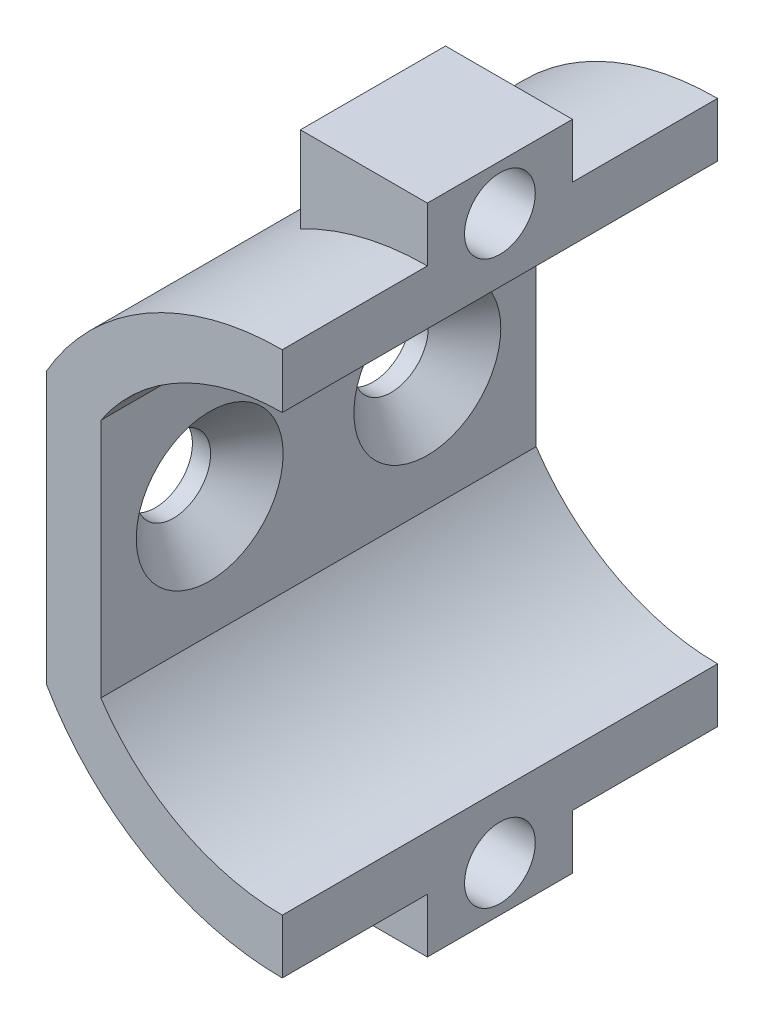
ISO-10303-21;
HEADER;
FILE_DESCRIPTION(('STEP AP214'),'2;1');
FILE_NAME('part.step','',(''),(''),'','','');
FILE_SCHEMA(('AUTOMOTIVE_DESIGN { 1 0 10303 214 1 1 1 1 }'));
ENDSEC;
DATA;
#1=APPLICATION_CONTEXT('core data for automotive mechanical design processes');
#2=APPLICATION_PROTOCOL_DEFINITION('international standard','automotive_design',2000,#1);
#3=PRODUCT_CONTEXT('',#1,'mechanical');
#4=PRODUCT('Part','Part','',(#3));
#5=PRODUCT_RELATED_PRODUCT_CATEGORY('part','',(#4));
#6=PRODUCT_DEFINITION_FORMATION('','',#4);
#7=PRODUCT_DEFINITION_CONTEXT('part definition',#1,'design');
#8=PRODUCT_DEFINITION('design','',#6,#7);
#9=PRODUCT_DEFINITION_SHAPE('','',#8);
#10=(LENGTH_UNIT() NAMED_UNIT(*) SI_UNIT(.MILLI.,.METRE.));
#11=(NAMED_UNIT(*) PLANE_ANGLE_UNIT() SI_UNIT($,.RADIAN.));
#12=(NAMED_UNIT(*) SI_UNIT($,.STERADIAN.) SOLID_ANGLE_UNIT());
#13=UNCERTAINTY_MEASURE_WITH_UNIT(LENGTH_MEASURE(1.E-05),#10,'distance_accuracy_value','');
#14=(GEOMETRIC_REPRESENTATION_CONTEXT(3) GLOBAL_UNCERTAINTY_ASSIGNED_CONTEXT((#13)) GLOBAL_UNIT_ASSIGNED_CONTEXT((#10,
#11,#12)) REPRESENTATION_CONTEXT('',''));
#15=CARTESIAN_POINT('',(0.,0.,0.));
#16=DIRECTION('',(0.,0.,1.));
#17=DIRECTION('',(1.,0.,0.));
#18=AXIS2_PLACEMENT_3D('',#15,#16,#17);
#19=CARTESIAN_POINT('',(0.,0.,0.));
#20=DIRECTION('',(0.,0.,1.));
#21=DIRECTION('',(1.,0.,0.));
#22=AXIS2_PLACEMENT_3D('',#19,#20,#21);
#23=PLANE('',#22);
#24=DIRECTION('',(0.,-1.,0.));
#25=VECTOR('',#24,1.);
#26=CARTESIAN_POINT('',(0.,0.,0.));
#27=LINE('',#26,#25);
#28=CARTESIAN_POINT('',(0.,-6.00000000000003,0.));
#29=VERTEX_POINT('',#28);
#30=CARTESIAN_POINT('',(0.,-7.5,0.));
#31=VERTEX_POINT('',#30);
#32=EDGE_CURVE('E265',#29,#31,#27,.T.);
#33=ORIENTED_EDGE('',*,*,#32,.T.);
#34=CARTESIAN_POINT('',(0.,0.,0.));
#35=DIRECTION('',(0.,0.,1.));
#36=DIRECTION('',(1.,0.,0.));
#37=AXIS2_PLACEMENT_3D('',#34,#35,#36);
#38=CIRCLE('',#37,7.5);
#39=CARTESIAN_POINT('',(-6.50107738392439,-3.73978513396518,0.));
#40=VERTEX_POINT('',#39);
#41=EDGE_CURVE('E269',#40,#31,#38,.T.);
#42=ORIENTED_EDGE('',*,*,#41,.F.);
#43=DIRECTION('',(0.,-1.,0.));
#44=VECTOR('',#43,1.);
#45=CARTESIAN_POINT('',(-6.50107738392439,0.,0.));
#46=LINE('',#45,#44);
#47=CARTESIAN_POINT('',(-6.50107738392439,3.73978513396516,0.));
#48=VERTEX_POINT('',#47);
#49=EDGE_CURVE('E268',#48,#40,#46,.T.);
#50=ORIENTED_EDGE('',*,*,#49,.F.);
#51=CARTESIAN_POINT('',(0.,7.5,0.));
#52=VERTEX_POINT('',#51);
#53=EDGE_CURVE('E264',#52,#48,#38,.T.);
#54=ORIENTED_EDGE('',*,*,#53,.F.);
#55=CARTESIAN_POINT('',(0.,5.99999999999999,0.));
#56=VERTEX_POINT('',#55);
#57=EDGE_CURVE('E235',#52,#56,#27,.T.);
#58=ORIENTED_EDGE('',*,*,#57,.T.);
#59=CARTESIAN_POINT('',(0.,0.,0.));
#60=DIRECTION('',(0.,0.,1.));
#61=DIRECTION('',(1.,0.,0.));
#62=AXIS2_PLACEMENT_3D('',#59,#60,#61);
#63=CIRCLE('',#62,6.);
#64=CARTESIAN_POINT('',(-5.00107738392439,3.31499999999997,0.));
#65=VERTEX_POINT('',#64);
#66=EDGE_CURVE('E245',#56,#65,#63,.T.);
#67=ORIENTED_EDGE('',*,*,#66,.T.);
#68=DIRECTION('',(0.,-1.,0.));
#69=VECTOR('',#68,1.);
#70=CARTESIAN_POINT('',(-5.00107738392439,0.,0.));
#71=LINE('',#70,#69);
#72=CARTESIAN_POINT('',(-5.00107738392439,-3.31500000000002,0.));
#73=VERTEX_POINT('',#72);
#74=EDGE_CURVE('E276',#65,#73,#71,.T.);
#75=ORIENTED_EDGE('',*,*,#74,.T.);
#76=EDGE_CURVE('E272',#73,#29,#63,.T.);
#77=ORIENTED_EDGE('',*,*,#76,.T.);
#78=EDGE_LOOP('',(#33,#42,#50,#54,#58,#67,#75,#77));
#79=FACE_BOUND('',#78,.T.);
#80=ADVANCED_FACE('F46',(#79),#23,.F.);
#81=CARTESIAN_POINT('',(0.,0.,12.));
#82=DIRECTION('',(1.,0.,0.));
#83=DIRECTION('',(0.,0.,-1.));
#84=AXIS2_PLACEMENT_3D('',#81,#82,#83);
#85=PLANE('',#84);
#86=CARTESIAN_POINT('',(0.,-7.75,6.));
#87=DIRECTION('',(-1.,0.,0.));
#88=DIRECTION('',(0.,0.,-1.));
#89=AXIS2_PLACEMENT_3D('',#86,#87,#88);
#90=CIRCLE('',#89,0.975);
#91=CARTESIAN_POINT('',(0.,-7.75,5.025));
#92=VERTEX_POINT('',#91);
#93=EDGE_CURVE('E174',#92,#92,#90,.T.);
#94=ORIENTED_EDGE('',*,*,#93,.T.);
#95=EDGE_LOOP('',(#94));
#96=FACE_BOUND('',#95,.T.);
#97=DIRECTION('',(0.,-1.,0.));
#98=VECTOR('',#97,1.);
#99=CARTESIAN_POINT('',(0.,0.,4.));
#100=LINE('',#99,#98);
#101=CARTESIAN_POINT('',(0.,-7.50000000000002,4.));
#102=VERTEX_POINT('',#101);
#103=CARTESIAN_POINT('',(0.,-9.,4.));
#104=VERTEX_POINT('',#103);
#105=EDGE_CURVE('E307',#102,#104,#100,.T.);
#106=ORIENTED_EDGE('',*,*,#105,.F.);
#107=DIRECTION('',(0.,0.,-1.));
#108=VECTOR('',#107,1.);
#109=CARTESIAN_POINT('',(0.,-7.50000000000002,13.6410752421119));
#110=LINE('',#109,#108);
#111=EDGE_CURVE('E171',#102,#31,#110,.T.);
#112=ORIENTED_EDGE('',*,*,#111,.T.);
#113=ORIENTED_EDGE('',*,*,#32,.F.);
#114=DIRECTION('',(0.,0.,-1.));
#115=VECTOR('',#114,1.);
#116=CARTESIAN_POINT('',(0.,-6.,12.));
#117=LINE('',#116,#115);
#118=CARTESIAN_POINT('',(0.,-6.,12.));
#119=VERTEX_POINT('',#118);
#120=EDGE_CURVE('E290',#119,#29,#117,.T.);
#121=ORIENTED_EDGE('',*,*,#120,.F.);
#122=DIRECTION('',(0.,-1.,0.));
#123=VECTOR('',#122,1.);
#124=CARTESIAN_POINT('',(0.,0.,12.));
#125=LINE('',#124,#123);
#126=CARTESIAN_POINT('',(0.,-7.5,12.));
#127=VERTEX_POINT('',#126);
#128=EDGE_CURVE('E246',#119,#127,#125,.T.);
#129=ORIENTED_EDGE('',*,*,#128,.T.);
#130=DIRECTION('',(0.,0.,1.));
#131=VECTOR('',#130,1.);
#132=CARTESIAN_POINT('',(0.,-7.50000000000002,-1.6410752421119));
#133=LINE('',#132,#131);
#134=CARTESIAN_POINT('',(0.,-7.5,8.));
#135=VERTEX_POINT('',#134);
#136=EDGE_CURVE('E188',#135,#127,#133,.T.);
#137=ORIENTED_EDGE('',*,*,#136,.F.);
#138=DIRECTION('',(0.,-1.,0.));
#139=VECTOR('',#138,1.);
#140=CARTESIAN_POINT('',(0.,0.,8.));
#141=LINE('',#140,#139);
#142=CARTESIAN_POINT('',(0.,-9.,8.));
#143=VERTEX_POINT('',#142);
#144=EDGE_CURVE('E363',#135,#143,#141,.T.);
#145=ORIENTED_EDGE('',*,*,#144,.T.);
#146=DIRECTION('',(0.,0.,1.));
#147=VECTOR('',#146,1.);
#148=CARTESIAN_POINT('',(0.,-9.,-4.22510444216538));
#149=LINE('',#148,#147);
#150=EDGE_CURVE('E182',#104,#143,#149,.T.);
#151=ORIENTED_EDGE('',*,*,#150,.F.);
#152=EDGE_LOOP('',(#106,#112,#113,#121,#129,#137,#145,#151));
#153=FACE_BOUND('',#152,.T.);
#154=ADVANCED_FACE('F373',(#96,#153),#85,.T.);
#155=CARTESIAN_POINT('',(0.,-9.,-4.22510444216538));
#156=DIRECTION('',(0.,1.,0.));
#157=DIRECTION('',(0.,0.,1.));
#158=AXIS2_PLACEMENT_3D('',#155,#156,#157);
#159=PLANE('',#158);
#160=DIRECTION('',(0.,0.,1.));
#161=VECTOR('',#160,1.);
#162=CARTESIAN_POINT('',(-3.5,-9.00000000000003,-4.22510444216538));
#163=LINE('',#162,#161);
#164=CARTESIAN_POINT('',(-3.5,-9.,4.));
#165=VERTEX_POINT('',#164);
#166=CARTESIAN_POINT('',(-3.5,-9.00000000000003,8.));
#167=VERTEX_POINT('',#166);
#168=EDGE_CURVE('E181',#165,#167,#163,.T.);
#169=ORIENTED_EDGE('',*,*,#168,.F.);
#170=DIRECTION('',(1.,0.,0.));
#171=VECTOR('',#170,1.);
#172=CARTESIAN_POINT('',(0.,-9.,4.));
#173=LINE('',#172,#171);
#174=EDGE_CURVE('E163',#165,#104,#173,.T.);
#175=ORIENTED_EDGE('',*,*,#174,.T.);
#176=ORIENTED_EDGE('',*,*,#150,.T.);
#177=DIRECTION('',(1.,0.,0.));
#178=VECTOR('',#177,1.);
#179=CARTESIAN_POINT('',(0.,-9.,8.));
#180=LINE('',#179,#178);
#181=EDGE_CURVE('E359',#167,#143,#180,.T.);
#182=ORIENTED_EDGE('',*,*,#181,.F.);
#183=EDGE_LOOP('',(#169,#175,#176,#182));
#184=FACE_BOUND('',#183,.T.);
#185=ADVANCED_FACE('F409',(#184),#159,.F.);
#186=CARTESIAN_POINT('',(-3.5,0.,-4.22510444216538));
#187=DIRECTION('',(1.,0.,0.));
#188=DIRECTION('',(0.,1.,0.));
#189=AXIS2_PLACEMENT_3D('',#186,#187,#188);
#190=PLANE('',#189);
#191=CARTESIAN_POINT('',(-3.5,-7.75000000000002,6.));
#192=DIRECTION('',(1.,0.,0.));
#193=DIRECTION('',(0.,1.,0.));
#194=AXIS2_PLACEMENT_3D('',#191,#192,#193);
#195=CIRCLE('',#194,0.975);
#196=CARTESIAN_POINT('',(-3.5,-6.77500000000002,6.));
#197=VERTEX_POINT('',#196);
#198=EDGE_CURVE('E346',#197,#197,#195,.T.);
#199=ORIENTED_EDGE('',*,*,#198,.T.);
#200=EDGE_LOOP('',(#199));
#201=FACE_BOUND('',#200,.T.);
#202=DIRECTION('',(0.,0.,1.));
#203=VECTOR('',#202,1.);
#204=CARTESIAN_POINT('',(-3.5,-6.63324958071082,-4.22510444216538));
#205=LINE('',#204,#203);
#206=CARTESIAN_POINT('',(-3.5,-6.63324958071082,4.));
#207=VERTEX_POINT('',#206);
#208=CARTESIAN_POINT('',(-3.5,-6.6332495807108,8.));
#209=VERTEX_POINT('',#208);
#210=EDGE_CURVE('E70',#207,#209,#205,.T.);
#211=ORIENTED_EDGE('',*,*,#210,.F.);
#212=DIRECTION('',(0.,-1.,0.));
#213=VECTOR('',#212,1.);
#214=CARTESIAN_POINT('',(-3.5,0.,4.));
#215=LINE('',#214,#213);
#216=EDGE_CURVE('E160',#207,#165,#215,.T.);
#217=ORIENTED_EDGE('',*,*,#216,.T.);
#218=ORIENTED_EDGE('',*,*,#168,.T.);
#219=DIRECTION('',(0.,-1.,0.));
#220=VECTOR('',#219,1.);
#221=CARTESIAN_POINT('',(-3.5,0.,8.));
#222=LINE('',#221,#220);
#223=EDGE_CURVE('E179',#209,#167,#222,.T.);
#224=ORIENTED_EDGE('',*,*,#223,.F.);
#225=EDGE_LOOP('',(#211,#217,#218,#224));
#226=FACE_BOUND('',#225,.T.);
#227=ADVANCED_FACE('F177',(#201,#226),#190,.F.);
#228=CARTESIAN_POINT('',(0.,0.,12.));
#229=DIRECTION('',(0.,0.,-1.));
#230=DIRECTION('',(-1.,0.,0.));
#231=AXIS2_PLACEMENT_3D('',#228,#229,#230);
#232=CYLINDRICAL_SURFACE('',#231,7.5);
#233=ORIENTED_EDGE('',*,*,#41,.T.);
#234=ORIENTED_EDGE('',*,*,#111,.F.);
#235=CARTESIAN_POINT('',(0.,0.,4.));
#236=DIRECTION('',(0.,0.,1.));
#237=DIRECTION('',(1.,0.,0.));
#238=AXIS2_PLACEMENT_3D('',#235,#236,#237);
#239=CIRCLE('',#238,7.5);
#240=EDGE_CURVE('E63',#102,#207,#239,.F.);
#241=ORIENTED_EDGE('',*,*,#240,.T.);
#242=ORIENTED_EDGE('',*,*,#210,.T.);
#243=CARTESIAN_POINT('',(0.,0.,8.));
#244=DIRECTION('',(0.,0.,1.));
#245=DIRECTION('',(1.,0.,0.));
#246=AXIS2_PLACEMENT_3D('',#243,#244,#245);
#247=CIRCLE('',#246,7.5);
#248=EDGE_CURVE('E167',#209,#135,#247,.T.);
#249=ORIENTED_EDGE('',*,*,#248,.T.);
#250=ORIENTED_EDGE('',*,*,#136,.T.);
#251=CARTESIAN_POINT('',(0.,0.,12.));
#252=DIRECTION('',(0.,0.,1.));
#253=DIRECTION('',(1.,0.,0.));
#254=AXIS2_PLACEMENT_3D('',#251,#252,#253);
#255=CIRCLE('',#254,7.5);
#256=CARTESIAN_POINT('',(-6.50107738392439,-3.73978513396516,12.));
#257=VERTEX_POINT('',#256);
#258=EDGE_CURVE('E250',#257,#127,#255,.T.);
#259=ORIENTED_EDGE('',*,*,#258,.F.);
#260=DIRECTION('',(0.,0.,-1.));
#261=VECTOR('',#260,1.);
#262=CARTESIAN_POINT('',(-6.50107738392439,-3.73978513396516,12.));
#263=LINE('',#262,#261);
#264=EDGE_CURVE('E293',#257,#40,#263,.T.);
#265=ORIENTED_EDGE('',*,*,#264,.T.);
#266=EDGE_LOOP('',(#233,#234,#241,#242,#249,#250,#259,#265));
#267=FACE_BOUND('',#266,.T.);
#268=ADVANCED_FACE('F169',(#267),#232,.T.);
#269=CARTESIAN_POINT('',(0.,7.74999999999999,6.00000000000001));
#270=DIRECTION('',(1.,0.,0.));
#271=DIRECTION('',(0.,0.,-1.));
#272=AXIS2_PLACEMENT_3D('',#269,#270,#271);
#273=CIRCLE('',#272,0.975);
#274=CARTESIAN_POINT('',(0.,7.74999999999999,5.025));
#275=VERTEX_POINT('',#274);
#276=EDGE_CURVE('E192',#275,#275,#273,.T.);
#277=ORIENTED_EDGE('',*,*,#276,.F.);
#278=EDGE_LOOP('',(#277));
#279=FACE_BOUND('',#278,.T.);
#280=DIRECTION('',(0.,-1.,0.));
#281=VECTOR('',#280,1.);
#282=CARTESIAN_POINT('',(0.,0.,4.));
#283=LINE('',#282,#281);
#284=CARTESIAN_POINT('',(0.,8.99999999999999,4.));
#285=VERTEX_POINT('',#284);
#286=CARTESIAN_POINT('',(0.,7.49999999999993,4.));
#287=VERTEX_POINT('',#286);
#288=EDGE_CURVE('E212',#285,#287,#283,.T.);
#289=ORIENTED_EDGE('',*,*,#288,.F.);
#290=DIRECTION('',(0.,0.,1.));
#291=VECTOR('',#290,1.);
#292=CARTESIAN_POINT('',(0.,9.,-4.22510444216538));
#293=LINE('',#292,#291);
#294=CARTESIAN_POINT('',(0.,8.99999999999999,8.));
#295=VERTEX_POINT('',#294);
#296=EDGE_CURVE('E232',#285,#295,#293,.T.);
#297=ORIENTED_EDGE('',*,*,#296,.T.);
#298=DIRECTION('',(0.,-1.,0.));
#299=VECTOR('',#298,1.);
#300=CARTESIAN_POINT('',(0.,0.,8.));
#301=LINE('',#300,#299);
#302=CARTESIAN_POINT('',(0.,7.5,8.));
#303=VERTEX_POINT('',#302);
#304=EDGE_CURVE('E223',#295,#303,#301,.T.);
#305=ORIENTED_EDGE('',*,*,#304,.T.);
#306=DIRECTION('',(0.,0.,1.));
#307=VECTOR('',#306,1.);
#308=CARTESIAN_POINT('',(0.,7.5,-1.6410752421119));
#309=LINE('',#308,#307);
#310=CARTESIAN_POINT('',(0.,7.5,12.));
#311=VERTEX_POINT('',#310);
#312=EDGE_CURVE('E227',#303,#311,#309,.T.);
#313=ORIENTED_EDGE('',*,*,#312,.T.);
#314=CARTESIAN_POINT('',(0.,5.99999999999999,12.));
#315=VERTEX_POINT('',#314);
#316=EDGE_CURVE('E241',#311,#315,#125,.T.);
#317=ORIENTED_EDGE('',*,*,#316,.T.);
#318=DIRECTION('',(0.,0.,-1.));
#319=VECTOR('',#318,1.);
#320=CARTESIAN_POINT('',(0.,5.99999999999999,12.));
#321=LINE('',#320,#319);
#322=EDGE_CURVE('E280',#315,#56,#321,.T.);
#323=ORIENTED_EDGE('',*,*,#322,.T.);
#324=ORIENTED_EDGE('',*,*,#57,.F.);
#325=DIRECTION('',(0.,0.,-1.));
#326=VECTOR('',#325,1.);
#327=CARTESIAN_POINT('',(0.,7.49999999999993,13.6410752421119));
#328=LINE('',#327,#326);
#329=EDGE_CURVE('E202',#287,#52,#328,.T.);
#330=ORIENTED_EDGE('',*,*,#329,.F.);
#331=EDGE_LOOP('',(#289,#297,#305,#313,#317,#323,#324,#330));
#332=FACE_BOUND('',#331,.T.);
#333=ADVANCED_FACE('F432',(#279,#332),#85,.T.);
#334=CARTESIAN_POINT('',(0.,0.,12.));
#335=DIRECTION('',(0.,0.,1.));
#336=DIRECTION('',(1.,0.,0.));
#337=AXIS2_PLACEMENT_3D('',#334,#335,#336);
#338=PLANE('',#337);
#339=ORIENTED_EDGE('',*,*,#258,.T.);
#340=ORIENTED_EDGE('',*,*,#128,.F.);
#341=CARTESIAN_POINT('',(0.,0.,12.));
#342=DIRECTION('',(0.,0.,1.));
#343=DIRECTION('',(1.,0.,0.));
#344=AXIS2_PLACEMENT_3D('',#341,#342,#343);
#345=CIRCLE('',#344,6.);
#346=CARTESIAN_POINT('',(-5.00107738392439,-3.315,12.));
#347=VERTEX_POINT('',#346);
#348=EDGE_CURVE('E253',#347,#119,#345,.T.);
#349=ORIENTED_EDGE('',*,*,#348,.F.);
#350=DIRECTION('',(0.,-1.,0.));
#351=VECTOR('',#350,1.);
#352=CARTESIAN_POINT('',(-5.00107738392439,0.,12.));
#353=LINE('',#352,#351);
#354=CARTESIAN_POINT('',(-5.00107738392439,3.31499999999997,12.));
#355=VERTEX_POINT('',#354);
#356=EDGE_CURVE('E257',#355,#347,#353,.T.);
#357=ORIENTED_EDGE('',*,*,#356,.F.);
#358=EDGE_CURVE('E258',#315,#355,#345,.T.);
#359=ORIENTED_EDGE('',*,*,#358,.F.);
#360=ORIENTED_EDGE('',*,*,#316,.F.);
#361=CARTESIAN_POINT('',(-6.50107738392439,3.73978513396516,12.));
#362=VERTEX_POINT('',#361);
#363=EDGE_CURVE('E244',#311,#362,#255,.T.);
#364=ORIENTED_EDGE('',*,*,#363,.T.);
#365=DIRECTION('',(0.,-1.,0.));
#366=VECTOR('',#365,1.);
#367=CARTESIAN_POINT('',(-6.50107738392439,0.,12.));
#368=LINE('',#367,#366);
#369=EDGE_CURVE('E249',#362,#257,#368,.T.);
#370=ORIENTED_EDGE('',*,*,#369,.T.);
#371=EDGE_LOOP('',(#339,#340,#349,#357,#359,#360,#364,#370));
#372=FACE_BOUND('',#371,.T.);
#373=ADVANCED_FACE('F379',(#372),#338,.T.);
#374=CARTESIAN_POINT('',(0.,9.,-4.22510444216538));
#375=DIRECTION('',(0.,1.,0.));
#376=DIRECTION('',(0.,0.,1.));
#377=AXIS2_PLACEMENT_3D('',#374,#375,#376);
#378=PLANE('',#377);
#379=DIRECTION('',(1.,0.,0.));
#380=VECTOR('',#379,1.);
#381=CARTESIAN_POINT('',(0.,8.99999999999999,4.));
#382=LINE('',#381,#380);
#383=CARTESIAN_POINT('',(-3.5,9.,4.));
#384=VERTEX_POINT('',#383);
#385=EDGE_CURVE('E209',#384,#285,#382,.T.);
#386=ORIENTED_EDGE('',*,*,#385,.F.);
#387=DIRECTION('',(0.,0.,1.));
#388=VECTOR('',#387,1.);
#389=CARTESIAN_POINT('',(-3.5,9.00000000000001,-4.22510444216538));
#390=LINE('',#389,#388);
#391=CARTESIAN_POINT('',(-3.5,9.,8.));
#392=VERTEX_POINT('',#391);
#393=EDGE_CURVE('E231',#384,#392,#390,.T.);
#394=ORIENTED_EDGE('',*,*,#393,.T.);
#395=DIRECTION('',(1.,0.,0.));
#396=VECTOR('',#395,1.);
#397=CARTESIAN_POINT('',(0.,8.99999999999999,8.));
#398=LINE('',#397,#396);
#399=EDGE_CURVE('E219',#392,#295,#398,.T.);
#400=ORIENTED_EDGE('',*,*,#399,.T.);
#401=ORIENTED_EDGE('',*,*,#296,.F.);
#402=EDGE_LOOP('',(#386,#394,#400,#401));
#403=FACE_BOUND('',#402,.T.);
#404=ADVANCED_FACE('F486',(#403),#378,.T.);
#405=CARTESIAN_POINT('',(-3.5,0.,-4.22510444216538));
#406=DIRECTION('',(-1.,0.,0.));
#407=DIRECTION('',(0.,-1.,0.));
#408=AXIS2_PLACEMENT_3D('',#405,#406,#407);
#409=PLANE('',#408);
#410=CARTESIAN_POINT('',(-3.5,7.75,6.));
#411=DIRECTION('',(-1.,0.,0.));
#412=DIRECTION('',(0.,-1.,0.));
#413=AXIS2_PLACEMENT_3D('',#410,#411,#412);
#414=CIRCLE('',#413,0.975);
#415=CARTESIAN_POINT('',(-3.5,6.775,6.));
#416=VERTEX_POINT('',#415);
#417=EDGE_CURVE('E186',#416,#416,#414,.F.);
#418=ORIENTED_EDGE('',*,*,#417,.T.);
#419=EDGE_LOOP('',(#418));
#420=FACE_BOUND('',#419,.T.);
#421=DIRECTION('',(0.,1.,0.));
#422=VECTOR('',#421,1.);
#423=CARTESIAN_POINT('',(-3.5,0.,4.));
#424=LINE('',#423,#422);
#425=CARTESIAN_POINT('',(-3.5,6.6332495807108,4.));
#426=VERTEX_POINT('',#425);
#427=EDGE_CURVE('E206',#426,#384,#424,.T.);
#428=ORIENTED_EDGE('',*,*,#427,.F.);
#429=DIRECTION('',(0.,0.,1.));
#430=VECTOR('',#429,1.);
#431=CARTESIAN_POINT('',(-3.5,6.6332495807108,-4.22510444216538));
#432=LINE('',#431,#430);
#433=CARTESIAN_POINT('',(-3.5,6.6332495807108,7.99999999999999));
#434=VERTEX_POINT('',#433);
#435=EDGE_CURVE('E236',#426,#434,#432,.T.);
#436=ORIENTED_EDGE('',*,*,#435,.T.);
#437=DIRECTION('',(0.,1.,0.));
#438=VECTOR('',#437,1.);
#439=CARTESIAN_POINT('',(-3.5,0.,8.));
#440=LINE('',#439,#438);
#441=EDGE_CURVE('E301',#434,#392,#440,.T.);
#442=ORIENTED_EDGE('',*,*,#441,.T.);
#443=ORIENTED_EDGE('',*,*,#393,.F.);
#444=EDGE_LOOP('',(#428,#436,#442,#443));
#445=FACE_BOUND('',#444,.T.);
#446=ADVANCED_FACE('F455',(#420,#445),#409,.T.);
#447=ORIENTED_EDGE('',*,*,#435,.F.);
#448=CARTESIAN_POINT('',(0.,0.,4.));
#449=DIRECTION('',(0.,0.,1.));
#450=DIRECTION('',(1.,0.,0.));
#451=AXIS2_PLACEMENT_3D('',#448,#449,#450);
#452=CIRCLE('',#451,7.5);
#453=EDGE_CURVE('E196',#287,#426,#452,.T.);
#454=ORIENTED_EDGE('',*,*,#453,.F.);
#455=ORIENTED_EDGE('',*,*,#329,.T.);
#456=ORIENTED_EDGE('',*,*,#53,.T.);
#457=DIRECTION('',(0.,0.,-1.));
#458=VECTOR('',#457,1.);
#459=CARTESIAN_POINT('',(-6.50107738392439,3.73978513396516,12.));
#460=LINE('',#459,#458);
#461=EDGE_CURVE('E297',#362,#48,#460,.T.);
#462=ORIENTED_EDGE('',*,*,#461,.F.);
#463=ORIENTED_EDGE('',*,*,#363,.F.);
#464=ORIENTED_EDGE('',*,*,#312,.F.);
#465=CARTESIAN_POINT('',(0.,0.,8.));
#466=DIRECTION('',(0.,0.,1.));
#467=DIRECTION('',(1.,0.,0.));
#468=AXIS2_PLACEMENT_3D('',#465,#466,#467);
#469=CIRCLE('',#468,7.5);
#470=EDGE_CURVE('E215',#434,#303,#469,.F.);
#471=ORIENTED_EDGE('',*,*,#470,.F.);
#472=EDGE_LOOP('',(#447,#454,#455,#456,#462,#463,#464,#471));
#473=FACE_BOUND('',#472,.T.);
#474=ADVANCED_FACE('F443',(#473),#232,.T.);
#475=CARTESIAN_POINT('',(-6.50107738392439,0.,12.));
#476=DIRECTION('',(1.,0.,0.));
#477=DIRECTION('',(0.,0.,-1.));
#478=AXIS2_PLACEMENT_3D('',#475,#476,#477);
#479=PLANE('',#478);
#480=CARTESIAN_POINT('',(-6.50107738392439,0.,9.));
#481=DIRECTION('',(1.,0.,0.));
#482=DIRECTION('',(0.,0.,-1.));
#483=AXIS2_PLACEMENT_3D('',#480,#481,#482);
#484=CIRCLE('',#483,1.025);
#485=CARTESIAN_POINT('',(-6.50107738392439,0.,7.975));
#486=VERTEX_POINT('',#485);
#487=EDGE_CURVE('E342',#486,#486,#484,.F.);
#488=ORIENTED_EDGE('',*,*,#487,.F.);
#489=EDGE_LOOP('',(#488));
#490=FACE_BOUND('',#489,.T.);
#491=CARTESIAN_POINT('',(-6.50107738392439,0.,3.));
#492=DIRECTION('',(1.,0.,0.));
#493=DIRECTION('',(0.,0.,-1.));
#494=AXIS2_PLACEMENT_3D('',#491,#492,#493);
#495=CIRCLE('',#494,1.025);
#496=CARTESIAN_POINT('',(-6.50107738392439,0.,1.975));
#497=VERTEX_POINT('',#496);
#498=EDGE_CURVE('E339',#497,#497,#495,.F.);
#499=ORIENTED_EDGE('',*,*,#498,.F.);
#500=EDGE_LOOP('',(#499));
#501=FACE_BOUND('',#500,.T.);
#502=ORIENTED_EDGE('',*,*,#49,.T.);
#503=ORIENTED_EDGE('',*,*,#264,.F.);
#504=ORIENTED_EDGE('',*,*,#369,.F.);
#505=ORIENTED_EDGE('',*,*,#461,.T.);
#506=EDGE_LOOP('',(#502,#503,#504,#505));
#507=FACE_BOUND('',#506,.T.);
#508=ADVANCED_FACE('F385',(#490,#501,#507),#479,.F.);
#509=CARTESIAN_POINT('',(0.,0.,12.));
#510=DIRECTION('',(0.,0.,-1.));
#511=DIRECTION('',(-1.,0.,0.));
#512=AXIS2_PLACEMENT_3D('',#509,#510,#511);
#513=CYLINDRICAL_SURFACE('',#512,6.);
#514=ORIENTED_EDGE('',*,*,#76,.F.);
#515=DIRECTION('',(0.,0.,-1.));
#516=VECTOR('',#515,1.);
#517=CARTESIAN_POINT('',(-5.00107738392439,-3.315,12.));
#518=LINE('',#517,#516);
#519=EDGE_CURVE('E287',#347,#73,#518,.T.);
#520=ORIENTED_EDGE('',*,*,#519,.F.);
#521=ORIENTED_EDGE('',*,*,#348,.T.);
#522=ORIENTED_EDGE('',*,*,#120,.T.);
#523=EDGE_LOOP('',(#514,#520,#521,#522));
#524=FACE_BOUND('',#523,.T.);
#525=ADVANCED_FACE('F406',(#524),#513,.F.);
#526=CARTESIAN_POINT('',(-5.00107738392439,0.,12.));
#527=DIRECTION('',(1.,0.,0.));
#528=DIRECTION('',(0.,0.,-1.));
#529=AXIS2_PLACEMENT_3D('',#526,#527,#528);
#530=PLANE('',#529);
#531=CARTESIAN_POINT('',(-5.00107738392439,0.,2.99999999999999));
#532=DIRECTION('',(1.,0.,0.));
#533=DIRECTION('',(0.,0.,-1.));
#534=AXIS2_PLACEMENT_3D('',#531,#532,#533);
#535=CIRCLE('',#534,2.02500000000001);
#536=CARTESIAN_POINT('',(-5.00107738392439,0.,0.974999999999983));
#537=VERTEX_POINT('',#536);
#538=EDGE_CURVE('E56',#537,#537,#535,.F.);
#539=ORIENTED_EDGE('',*,*,#538,.T.);
#540=EDGE_LOOP('',(#539));
#541=FACE_BOUND('',#540,.T.);
#542=CARTESIAN_POINT('',(-5.00107738392439,0.,8.99999999999999));
#543=DIRECTION('',(1.,0.,0.));
#544=DIRECTION('',(0.,0.,-1.));
#545=AXIS2_PLACEMENT_3D('',#542,#543,#544);
#546=CIRCLE('',#545,2.02500000000001);
#547=CARTESIAN_POINT('',(-5.00107738392439,0.,6.97499999999999));
#548=VERTEX_POINT('',#547);
#549=EDGE_CURVE('E316',#548,#548,#546,.F.);
#550=ORIENTED_EDGE('',*,*,#549,.T.);
#551=EDGE_LOOP('',(#550));
#552=FACE_BOUND('',#551,.T.);
#553=ORIENTED_EDGE('',*,*,#74,.F.);
#554=DIRECTION('',(0.,0.,-1.));
#555=VECTOR('',#554,1.);
#556=CARTESIAN_POINT('',(-5.00107738392439,3.31499999999997,12.));
#557=LINE('',#556,#555);
#558=EDGE_CURVE('E284',#355,#65,#557,.T.);
#559=ORIENTED_EDGE('',*,*,#558,.F.);
#560=ORIENTED_EDGE('',*,*,#356,.T.);
#561=ORIENTED_EDGE('',*,*,#519,.T.);
#562=EDGE_LOOP('',(#553,#559,#560,#561));
#563=FACE_BOUND('',#562,.T.);
#564=ADVANCED_FACE('F323',(#541,#552,#563),#530,.T.);
#565=ORIENTED_EDGE('',*,*,#66,.F.);
#566=ORIENTED_EDGE('',*,*,#322,.F.);
#567=ORIENTED_EDGE('',*,*,#358,.T.);
#568=ORIENTED_EDGE('',*,*,#558,.T.);
#569=EDGE_LOOP('',(#565,#566,#567,#568));
#570=FACE_BOUND('',#569,.T.);
#571=ADVANCED_FACE('F399',(#570),#513,.F.);
#572=CARTESIAN_POINT('',(0.,0.,8.));
#573=DIRECTION('',(0.,0.,1.));
#574=DIRECTION('',(1.,0.,0.));
#575=AXIS2_PLACEMENT_3D('',#572,#573,#574);
#576=PLANE('',#575);
#577=ORIENTED_EDGE('',*,*,#399,.F.);
#578=ORIENTED_EDGE('',*,*,#441,.F.);
#579=ORIENTED_EDGE('',*,*,#470,.T.);
#580=ORIENTED_EDGE('',*,*,#304,.F.);
#581=EDGE_LOOP('',(#577,#578,#579,#580));
#582=FACE_BOUND('',#581,.T.);
#583=ADVANCED_FACE('F438',(#582),#576,.T.);
#584=CARTESIAN_POINT('',(0.,0.,4.));
#585=DIRECTION('',(0.,0.,1.));
#586=DIRECTION('',(1.,0.,0.));
#587=AXIS2_PLACEMENT_3D('',#584,#585,#586);
#588=PLANE('',#587);
#589=ORIENTED_EDGE('',*,*,#288,.T.);
#590=ORIENTED_EDGE('',*,*,#453,.T.);
#591=ORIENTED_EDGE('',*,*,#427,.T.);
#592=ORIENTED_EDGE('',*,*,#385,.T.);
#593=EDGE_LOOP('',(#589,#590,#591,#592));
#594=FACE_BOUND('',#593,.T.);
#595=ADVANCED_FACE('F421',(#594),#588,.F.);
#596=CARTESIAN_POINT('',(-6.50207738392439,7.74999999999994,6.00000000000001));
#597=DIRECTION('',(1.,0.,0.));
#598=DIRECTION('',(0.,0.,-1.));
#599=AXIS2_PLACEMENT_3D('',#596,#597,#598);
#600=CYLINDRICAL_SURFACE('',#599,0.975);
#601=ORIENTED_EDGE('',*,*,#417,.F.);
#602=EDGE_LOOP('',(#601));
#603=FACE_BOUND('',#602,.T.);
#604=ORIENTED_EDGE('',*,*,#276,.T.);
#605=EDGE_LOOP('',(#604));
#606=FACE_BOUND('',#605,.T.);
#607=ADVANCED_FACE('F414',(#603,#606),#600,.F.);
#608=CARTESIAN_POINT('',(0.,0.,8.));
#609=DIRECTION('',(0.,0.,1.));
#610=DIRECTION('',(1.,0.,0.));
#611=AXIS2_PLACEMENT_3D('',#608,#609,#610);
#612=PLANE('',#611);
#613=ORIENTED_EDGE('',*,*,#248,.F.);
#614=ORIENTED_EDGE('',*,*,#223,.T.);
#615=ORIENTED_EDGE('',*,*,#181,.T.);
#616=ORIENTED_EDGE('',*,*,#144,.F.);
#617=EDGE_LOOP('',(#613,#614,#615,#616));
#618=FACE_BOUND('',#617,.T.);
#619=ADVANCED_FACE('F412',(#618),#612,.T.);
#620=CARTESIAN_POINT('',(0.,0.,4.));
#621=DIRECTION('',(0.,0.,1.));
#622=DIRECTION('',(1.,0.,0.));
#623=AXIS2_PLACEMENT_3D('',#620,#621,#622);
#624=PLANE('',#623);
#625=ORIENTED_EDGE('',*,*,#240,.F.);
#626=ORIENTED_EDGE('',*,*,#105,.T.);
#627=ORIENTED_EDGE('',*,*,#174,.F.);
#628=ORIENTED_EDGE('',*,*,#216,.F.);
#629=EDGE_LOOP('',(#625,#626,#627,#628));
#630=FACE_BOUND('',#629,.T.);
#631=ADVANCED_FACE('F161',(#630),#624,.F.);
#632=CARTESIAN_POINT('',(-6.50207738392439,-7.75000000000002,6.));
#633=DIRECTION('',(1.,0.,0.));
#634=DIRECTION('',(0.,0.,-1.));
#635=AXIS2_PLACEMENT_3D('',#632,#633,#634);
#636=CYLINDRICAL_SURFACE('',#635,0.975);
#637=ORIENTED_EDGE('',*,*,#93,.F.);
#638=EDGE_LOOP('',(#637));
#639=FACE_BOUND('',#638,.T.);
#640=ORIENTED_EDGE('',*,*,#198,.F.);
#641=EDGE_LOOP('',(#640));
#642=FACE_BOUND('',#641,.T.);
#643=ADVANCED_FACE('F335',(#639,#642),#636,.F.);
#644=CARTESIAN_POINT('',(-6.50207738392439,0.,3.));
#645=DIRECTION('',(1.,0.,0.));
#646=DIRECTION('',(0.,0.,-1.));
#647=AXIS2_PLACEMENT_3D('',#644,#645,#646);
#648=CYLINDRICAL_SURFACE('',#647,1.025);
#649=CARTESIAN_POINT('',(-6.00107738392439,0.,3.));
#650=DIRECTION('',(1.,0.,0.));
#651=DIRECTION('',(0.,0.,-1.));
#652=AXIS2_PLACEMENT_3D('',#649,#650,#651);
#653=CIRCLE('',#652,1.025);
#654=CARTESIAN_POINT('',(-6.00107738392439,0.,1.975));
#655=VERTEX_POINT('',#654);
#656=EDGE_CURVE('E312',#655,#655,#653,.T.);
#657=ORIENTED_EDGE('',*,*,#656,.T.);
#658=EDGE_LOOP('',(#657));
#659=FACE_BOUND('',#658,.T.);
#660=ORIENTED_EDGE('',*,*,#498,.T.);
#661=EDGE_LOOP('',(#660));
#662=FACE_BOUND('',#661,.T.);
#663=ADVANCED_FACE('F332',(#659,#662),#648,.F.);
#664=CARTESIAN_POINT('',(-6.50207738392439,0.,9.));
#665=DIRECTION('',(1.,0.,0.));
#666=DIRECTION('',(0.,0.,-1.));
#667=AXIS2_PLACEMENT_3D('',#664,#665,#666);
#668=CYLINDRICAL_SURFACE('',#667,1.025);
#669=CARTESIAN_POINT('',(-6.00107738392439,0.,9.));
#670=DIRECTION('',(1.,0.,0.));
#671=DIRECTION('',(0.,0.,-1.));
#672=AXIS2_PLACEMENT_3D('',#669,#670,#671);
#673=CIRCLE('',#672,1.025);
#674=CARTESIAN_POINT('',(-6.00107738392439,0.,7.975));
#675=VERTEX_POINT('',#674);
#676=EDGE_CURVE('E12',#675,#675,#673,.T.);
#677=ORIENTED_EDGE('',*,*,#676,.T.);
#678=EDGE_LOOP('',(#677));
#679=FACE_BOUND('',#678,.T.);
#680=ORIENTED_EDGE('',*,*,#487,.T.);
#681=EDGE_LOOP('',(#680));
#682=FACE_BOUND('',#681,.T.);
#683=ADVANCED_FACE('F329',(#679,#682),#668,.F.);
#684=CARTESIAN_POINT('',(-6.00107738392439,0.,3.));
#685=DIRECTION('',(1.,0.,0.));
#686=DIRECTION('',(0.,0.,-1.));
#687=AXIS2_PLACEMENT_3D('',#684,#685,#686);
#688=CONICAL_SURFACE('',#687,1.025,0.78539816339745);
#689=ORIENTED_EDGE('',*,*,#538,.F.);
#690=EDGE_LOOP('',(#689));
#691=FACE_BOUND('',#690,.T.);
#692=ORIENTED_EDGE('',*,*,#656,.F.);
#693=EDGE_LOOP('',(#692));
#694=FACE_BOUND('',#693,.T.);
#695=ADVANCED_FACE('F326',(#691,#694),#688,.F.);
#696=CARTESIAN_POINT('',(-6.00107738392439,0.,9.));
#697=DIRECTION('',(1.,0.,0.));
#698=DIRECTION('',(0.,0.,-1.));
#699=AXIS2_PLACEMENT_3D('',#696,#697,#698);
#700=CONICAL_SURFACE('',#699,1.025,0.78539816339745);
#701=ORIENTED_EDGE('',*,*,#549,.F.);
#702=EDGE_LOOP('',(#701));
#703=FACE_BOUND('',#702,.T.);
#704=ORIENTED_EDGE('',*,*,#676,.F.);
#705=EDGE_LOOP('',(#704));
#706=FACE_BOUND('',#705,.T.);
#707=ADVANCED_FACE('F49',(#703,#706),#700,.F.);
#708=CLOSED_SHELL('',(#80,#154,#185,#227,#268,#333,#373,#404,#446,#474,#508,#525,#564,#571,#583,
#595,#607,#619,#631,#643,#663,#683,#695,#707));
#709=MANIFOLD_SOLID_BREP('B2',#708);
#710=ADVANCED_BREP_SHAPE_REPRESENTATION('',(#18,#709),#14);
#711=SHAPE_DEFINITION_REPRESENTATION(#9,#710);
ENDSEC;
END-ISO-10303-21;
